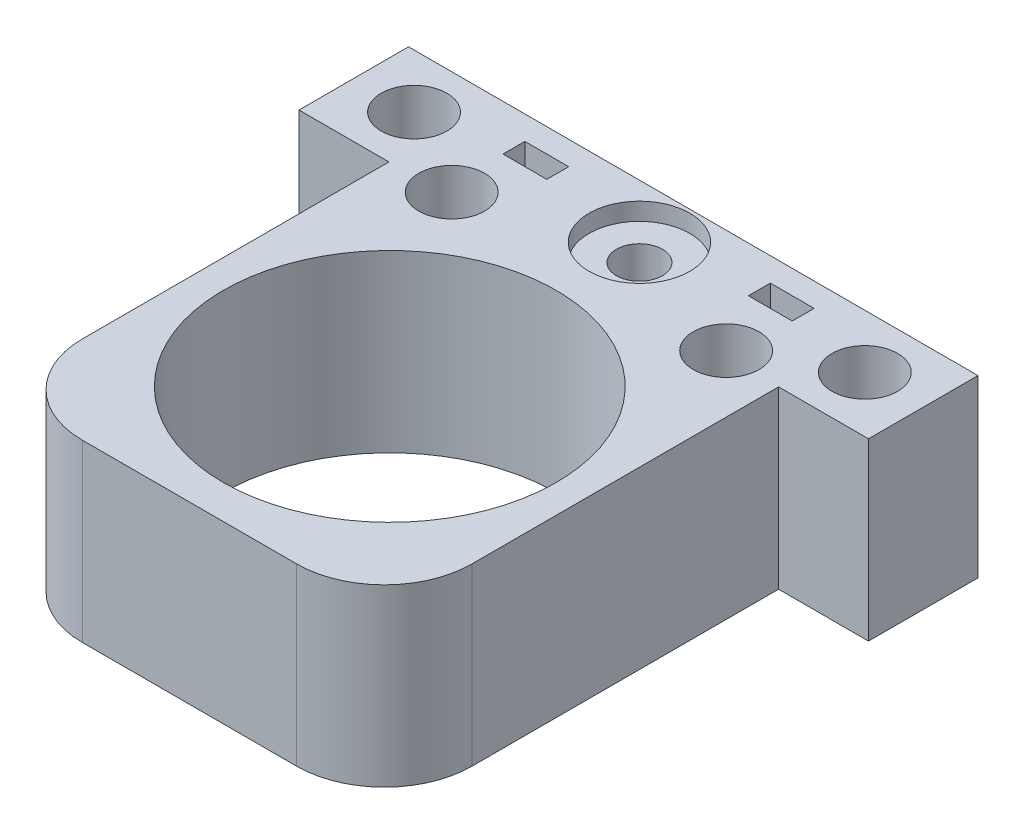
ISO-10303-21;
HEADER;
FILE_DESCRIPTION(('STEP AP214'),'2;1');
FILE_NAME('part.step','',(''),(''),'','','');
FILE_SCHEMA(('AUTOMOTIVE_DESIGN { 1 0 10303 214 1 1 1 1 }'));
ENDSEC;
DATA;
#1=APPLICATION_CONTEXT('core data for automotive mechanical design processes');
#2=APPLICATION_PROTOCOL_DEFINITION('international standard','automotive_design',2000,#1);
#3=PRODUCT_CONTEXT('',#1,'mechanical');
#4=PRODUCT('Part','Part','',(#3));
#5=PRODUCT_RELATED_PRODUCT_CATEGORY('part','',(#4));
#6=PRODUCT_DEFINITION_FORMATION('','',#4);
#7=PRODUCT_DEFINITION_CONTEXT('part definition',#1,'design');
#8=PRODUCT_DEFINITION('design','',#6,#7);
#9=PRODUCT_DEFINITION_SHAPE('','',#8);
#10=(LENGTH_UNIT() NAMED_UNIT(*) SI_UNIT(.MILLI.,.METRE.));
#11=(NAMED_UNIT(*) PLANE_ANGLE_UNIT() SI_UNIT($,.RADIAN.));
#12=(NAMED_UNIT(*) SI_UNIT($,.STERADIAN.) SOLID_ANGLE_UNIT());
#13=UNCERTAINTY_MEASURE_WITH_UNIT(LENGTH_MEASURE(1.E-05),#10,'distance_accuracy_value','');
#14=(GEOMETRIC_REPRESENTATION_CONTEXT(3) GLOBAL_UNCERTAINTY_ASSIGNED_CONTEXT((#13)) GLOBAL_UNIT_ASSIGNED_CONTEXT((#10,
#11,#12)) REPRESENTATION_CONTEXT('',''));
#15=CARTESIAN_POINT('',(0.,0.,0.));
#16=DIRECTION('',(0.,0.,1.));
#17=DIRECTION('',(1.,0.,0.));
#18=AXIS2_PLACEMENT_3D('',#15,#16,#17);
#19=CARTESIAN_POINT('',(0.,0.,-12.7142223868873));
#20=DIRECTION('',(0.,1.,0.));
#21=DIRECTION('',(0.,0.,1.));
#22=AXIS2_PLACEMENT_3D('',#19,#20,#21);
#23=CYLINDRICAL_SURFACE('',#22,5.25);
#24=CARTESIAN_POINT('',(0.,56.,-12.7142223868873));
#25=DIRECTION('',(0.,1.,0.));
#26=DIRECTION('',(0.,0.,1.));
#27=AXIS2_PLACEMENT_3D('',#24,#25,#26);
#28=CIRCLE('',#27,5.25);
#29=CARTESIAN_POINT('',(0.,56.,-7.46422238688734));
#30=VERTEX_POINT('',#29);
#31=EDGE_CURVE('E285',#30,#30,#28,.F.);
#32=ORIENTED_EDGE('',*,*,#31,.F.);
#33=EDGE_LOOP('',(#32));
#34=FACE_BOUND('',#33,.T.);
#35=CARTESIAN_POINT('',(0.,20.,-12.7142223868873));
#36=DIRECTION('',(0.,-1.,0.));
#37=DIRECTION('',(0.,0.,-1.));
#38=AXIS2_PLACEMENT_3D('',#35,#36,#37);
#39=CIRCLE('',#38,5.25);
#40=CARTESIAN_POINT('',(0.,20.,-17.9642223868873));
#41=VERTEX_POINT('',#40);
#42=EDGE_CURVE('E233',#41,#41,#39,.F.);
#43=ORIENTED_EDGE('',*,*,#42,.F.);
#44=EDGE_LOOP('',(#43));
#45=FACE_BOUND('',#44,.T.);
#46=ADVANCED_FACE('F37',(#34,#45),#23,.F.);
#47=CARTESIAN_POINT('',(65.,60.,-25.));
#48=DIRECTION('',(-1.,0.,0.));
#49=DIRECTION('',(0.,0.,1.));
#50=AXIS2_PLACEMENT_3D('',#47,#48,#49);
#51=PLANE('',#50);
#52=DIRECTION('',(0.,0.,-1.));
#53=VECTOR('',#52,1.);
#54=CARTESIAN_POINT('',(65.,60.,-25.));
#55=LINE('',#54,#53);
#56=CARTESIAN_POINT('',(65.,60.,0.));
#57=VERTEX_POINT('',#56);
#58=CARTESIAN_POINT('',(65.,60.,-25.));
#59=VERTEX_POINT('',#58);
#60=EDGE_CURVE('E291',#57,#59,#55,.T.);
#61=ORIENTED_EDGE('',*,*,#60,.F.);
#62=DIRECTION('',(0.,1.,0.));
#63=VECTOR('',#62,1.);
#64=CARTESIAN_POINT('',(65.,15.,0.));
#65=LINE('',#64,#63);
#66=CARTESIAN_POINT('',(65.,20.,0.));
#67=VERTEX_POINT('',#66);
#68=EDGE_CURVE('E199',#67,#57,#65,.T.);
#69=ORIENTED_EDGE('',*,*,#68,.F.);
#70=DIRECTION('',(0.,0.,1.));
#71=VECTOR('',#70,1.);
#72=CARTESIAN_POINT('',(65.,20.,90.));
#73=LINE('',#72,#71);
#74=CARTESIAN_POINT('',(65.,20.,-25.));
#75=VERTEX_POINT('',#74);
#76=EDGE_CURVE('E205',#75,#67,#73,.T.);
#77=ORIENTED_EDGE('',*,*,#76,.F.);
#78=DIRECTION('',(0.,-1.,0.));
#79=VECTOR('',#78,1.);
#80=CARTESIAN_POINT('',(65.,60.,-25.));
#81=LINE('',#80,#79);
#82=EDGE_CURVE('E302',#59,#75,#81,.T.);
#83=ORIENTED_EDGE('',*,*,#82,.F.);
#84=EDGE_LOOP('',(#61,#69,#77,#83));
#85=FACE_BOUND('',#84,.T.);
#86=ADVANCED_FACE('F348',(#85),#51,.F.);
#87=CARTESIAN_POINT('',(-65.,60.,-25.));
#88=DIRECTION('',(0.,0.,1.));
#89=DIRECTION('',(1.,0.,0.));
#90=AXIS2_PLACEMENT_3D('',#87,#88,#89);
#91=PLANE('',#90);
#92=DIRECTION('',(1.,0.,0.));
#93=VECTOR('',#92,1.);
#94=CARTESIAN_POINT('',(-65.,20.,-25.));
#95=LINE('',#94,#93);
#96=CARTESIAN_POINT('',(-65.,20.,-25.));
#97=VERTEX_POINT('',#96);
#98=EDGE_CURVE('E203',#97,#75,#95,.T.);
#99=ORIENTED_EDGE('',*,*,#98,.F.);
#100=DIRECTION('',(0.,-1.,0.));
#101=VECTOR('',#100,1.);
#102=CARTESIAN_POINT('',(-65.,60.,-25.));
#103=LINE('',#102,#101);
#104=CARTESIAN_POINT('',(-65.,60.,-25.));
#105=VERTEX_POINT('',#104);
#106=EDGE_CURVE('E299',#105,#97,#103,.T.);
#107=ORIENTED_EDGE('',*,*,#106,.F.);
#108=DIRECTION('',(-1.,0.,0.));
#109=VECTOR('',#108,1.);
#110=CARTESIAN_POINT('',(-65.,60.,-25.));
#111=LINE('',#110,#109);
#112=EDGE_CURVE('E296',#59,#105,#111,.T.);
#113=ORIENTED_EDGE('',*,*,#112,.F.);
#114=ORIENTED_EDGE('',*,*,#82,.T.);
#115=EDGE_LOOP('',(#99,#107,#113,#114));
#116=FACE_BOUND('',#115,.T.);
#117=ADVANCED_FACE('F354',(#116),#91,.F.);
#118=CARTESIAN_POINT('',(-65.,60.,-25.));
#119=DIRECTION('',(1.,0.,0.));
#120=DIRECTION('',(0.,0.,-1.));
#121=AXIS2_PLACEMENT_3D('',#118,#119,#120);
#122=PLANE('',#121);
#123=DIRECTION('',(0.,0.,-1.));
#124=VECTOR('',#123,1.);
#125=CARTESIAN_POINT('',(-65.,20.,90.));
#126=LINE('',#125,#124);
#127=CARTESIAN_POINT('',(-65.,20.,0.));
#128=VERTEX_POINT('',#127);
#129=EDGE_CURVE('E191',#128,#97,#126,.T.);
#130=ORIENTED_EDGE('',*,*,#129,.F.);
#131=DIRECTION('',(0.,1.,0.));
#132=VECTOR('',#131,1.);
#133=CARTESIAN_POINT('',(-65.,15.,0.));
#134=LINE('',#133,#132);
#135=CARTESIAN_POINT('',(-65.,60.,0.));
#136=VERTEX_POINT('',#135);
#137=EDGE_CURVE('E180',#128,#136,#134,.T.);
#138=ORIENTED_EDGE('',*,*,#137,.T.);
#139=DIRECTION('',(0.,0.,1.));
#140=VECTOR('',#139,1.);
#141=CARTESIAN_POINT('',(-65.,60.,-25.));
#142=LINE('',#141,#140);
#143=EDGE_CURVE('E187',#105,#136,#142,.T.);
#144=ORIENTED_EDGE('',*,*,#143,.F.);
#145=ORIENTED_EDGE('',*,*,#106,.T.);
#146=EDGE_LOOP('',(#130,#138,#144,#145));
#147=FACE_BOUND('',#146,.T.);
#148=ADVANCED_FACE('F357',(#147),#122,.F.);
#149=CARTESIAN_POINT('',(51.4526055476511,0.,-12.7142223868873));
#150=DIRECTION('',(0.,1.,0.));
#151=DIRECTION('',(0.,0.,1.));
#152=AXIS2_PLACEMENT_3D('',#149,#150,#151);
#153=CYLINDRICAL_SURFACE('',#152,7.5);
#154=CARTESIAN_POINT('',(51.4526055476511,60.,-12.7142223868873));
#155=DIRECTION('',(0.,1.,0.));
#156=DIRECTION('',(0.,0.,-1.));
#157=AXIS2_PLACEMENT_3D('',#154,#155,#156);
#158=CIRCLE('',#157,7.5);
#159=CARTESIAN_POINT('',(51.4526055476511,60.,-20.2142223868873));
#160=VERTEX_POINT('',#159);
#161=EDGE_CURVE('E292',#160,#160,#158,.T.);
#162=ORIENTED_EDGE('',*,*,#161,.T.);
#163=EDGE_LOOP('',(#162));
#164=FACE_BOUND('',#163,.T.);
#165=CARTESIAN_POINT('',(51.4526055476511,20.,-12.7142223868873));
#166=DIRECTION('',(0.,-1.,0.));
#167=DIRECTION('',(0.,0.,-1.));
#168=AXIS2_PLACEMENT_3D('',#165,#166,#167);
#169=CIRCLE('',#168,7.5);
#170=CARTESIAN_POINT('',(51.4526055476511,20.,-20.2142223868873));
#171=VERTEX_POINT('',#170);
#172=EDGE_CURVE('E230',#171,#171,#169,.F.);
#173=ORIENTED_EDGE('',*,*,#172,.F.);
#174=EDGE_LOOP('',(#173));
#175=FACE_BOUND('',#174,.T.);
#176=ADVANCED_FACE('F387',(#164,#175),#153,.F.);
#177=CARTESIAN_POINT('',(-51.4526055476511,0.,-12.7142223868873));
#178=DIRECTION('',(0.,1.,0.));
#179=DIRECTION('',(0.,0.,1.));
#180=AXIS2_PLACEMENT_3D('',#177,#178,#179);
#181=CYLINDRICAL_SURFACE('',#180,7.5);
#182=CARTESIAN_POINT('',(-51.4526055476511,60.,-12.7142223868873));
#183=DIRECTION('',(0.,1.,0.));
#184=DIRECTION('',(0.,0.,1.));
#185=AXIS2_PLACEMENT_3D('',#182,#183,#184);
#186=CIRCLE('',#185,7.5);
#187=CARTESIAN_POINT('',(-51.4526055476511,60.,-5.21422238688734));
#188=VERTEX_POINT('',#187);
#189=EDGE_CURVE('E288',#188,#188,#186,.T.);
#190=ORIENTED_EDGE('',*,*,#189,.T.);
#191=EDGE_LOOP('',(#190));
#192=FACE_BOUND('',#191,.T.);
#193=CARTESIAN_POINT('',(-51.4526055476511,20.,-12.7142223868873));
#194=DIRECTION('',(0.,-1.,0.));
#195=DIRECTION('',(0.,0.,-1.));
#196=AXIS2_PLACEMENT_3D('',#193,#194,#195);
#197=CIRCLE('',#196,7.5);
#198=CARTESIAN_POINT('',(-51.4526055476511,20.,-20.2142223868873));
#199=VERTEX_POINT('',#198);
#200=EDGE_CURVE('E227',#199,#199,#197,.F.);
#201=ORIENTED_EDGE('',*,*,#200,.F.);
#202=EDGE_LOOP('',(#201));
#203=FACE_BOUND('',#202,.T.);
#204=ADVANCED_FACE('F383',(#192,#203),#181,.F.);
#205=CARTESIAN_POINT('',(-33.01308524261,0.,-19.5794065637342));
#206=DIRECTION('',(-1.,0.,0.));
#207=DIRECTION('',(0.,0.,1.));
#208=AXIS2_PLACEMENT_3D('',#205,#206,#207);
#209=PLANE('',#208);
#210=DIRECTION('',(0.,0.,1.));
#211=VECTOR('',#210,1.);
#212=CARTESIAN_POINT('',(-33.01308524261,20.,-19.5794065637342));
#213=LINE('',#212,#211);
#214=CARTESIAN_POINT('',(-33.01308524261,20.,-19.5794065637342));
#215=VERTEX_POINT('',#214);
#216=CARTESIAN_POINT('',(-33.01308524261,20.,-14.5794065637342));
#217=VERTEX_POINT('',#216);
#218=EDGE_CURVE('E225',#215,#217,#213,.T.);
#219=ORIENTED_EDGE('',*,*,#218,.F.);
#220=DIRECTION('',(0.,1.,0.));
#221=VECTOR('',#220,1.);
#222=CARTESIAN_POINT('',(-33.01308524261,0.,-19.5794065637342));
#223=LINE('',#222,#221);
#224=CARTESIAN_POINT('',(-33.01308524261,60.,-19.5794065637342));
#225=VERTEX_POINT('',#224);
#226=EDGE_CURVE('E274',#215,#225,#223,.T.);
#227=ORIENTED_EDGE('',*,*,#226,.T.);
#228=DIRECTION('',(0.,0.,1.));
#229=VECTOR('',#228,1.);
#230=CARTESIAN_POINT('',(-33.01308524261,60.,-19.5794065637342));
#231=LINE('',#230,#229);
#232=CARTESIAN_POINT('',(-33.01308524261,60.,-14.5794065637342));
#233=VERTEX_POINT('',#232);
#234=EDGE_CURVE('E256',#225,#233,#231,.T.);
#235=ORIENTED_EDGE('',*,*,#234,.T.);
#236=DIRECTION('',(0.,1.,0.));
#237=VECTOR('',#236,1.);
#238=CARTESIAN_POINT('',(-33.01308524261,0.,-14.5794065637342));
#239=LINE('',#238,#237);
#240=EDGE_CURVE('E273',#217,#233,#239,.T.);
#241=ORIENTED_EDGE('',*,*,#240,.F.);
#242=EDGE_LOOP('',(#219,#227,#235,#241));
#243=FACE_BOUND('',#242,.T.);
#244=ADVANCED_FACE('F386',(#243),#209,.F.);
#245=CARTESIAN_POINT('',(-33.01308524261,0.,-19.5794065637342));
#246=DIRECTION('',(0.,0.,-1.));
#247=DIRECTION('',(-1.,0.,0.));
#248=AXIS2_PLACEMENT_3D('',#245,#246,#247);
#249=PLANE('',#248);
#250=DIRECTION('',(-1.,0.,0.));
#251=VECTOR('',#250,1.);
#252=CARTESIAN_POINT('',(-33.01308524261,20.,-19.5794065637342));
#253=LINE('',#252,#251);
#254=CARTESIAN_POINT('',(-23.01308524261,20.,-19.5794065637342));
#255=VERTEX_POINT('',#254);
#256=EDGE_CURVE('E223',#255,#215,#253,.T.);
#257=ORIENTED_EDGE('',*,*,#256,.F.);
#258=DIRECTION('',(0.,1.,0.));
#259=VECTOR('',#258,1.);
#260=CARTESIAN_POINT('',(-23.01308524261,0.,-19.5794065637342));
#261=LINE('',#260,#259);
#262=CARTESIAN_POINT('',(-23.01308524261,60.,-19.5794065637342));
#263=VERTEX_POINT('',#262);
#264=EDGE_CURVE('E277',#255,#263,#261,.T.);
#265=ORIENTED_EDGE('',*,*,#264,.T.);
#266=DIRECTION('',(-1.,0.,0.));
#267=VECTOR('',#266,1.);
#268=CARTESIAN_POINT('',(-33.01308524261,60.,-19.5794065637342));
#269=LINE('',#268,#267);
#270=EDGE_CURVE('E270',#263,#225,#269,.T.);
#271=ORIENTED_EDGE('',*,*,#270,.T.);
#272=ORIENTED_EDGE('',*,*,#226,.F.);
#273=EDGE_LOOP('',(#257,#265,#271,#272));
#274=FACE_BOUND('',#273,.T.);
#275=ADVANCED_FACE('F421',(#274),#249,.F.);
#276=CARTESIAN_POINT('',(-23.01308524261,0.,-19.5794065637342));
#277=DIRECTION('',(1.,0.,0.));
#278=DIRECTION('',(0.,0.,-1.));
#279=AXIS2_PLACEMENT_3D('',#276,#277,#278);
#280=PLANE('',#279);
#281=DIRECTION('',(0.,0.,-1.));
#282=VECTOR('',#281,1.);
#283=CARTESIAN_POINT('',(-23.01308524261,20.,-19.5794065637342));
#284=LINE('',#283,#282);
#285=CARTESIAN_POINT('',(-23.01308524261,20.,-14.5794065637342));
#286=VERTEX_POINT('',#285);
#287=EDGE_CURVE('E221',#286,#255,#284,.T.);
#288=ORIENTED_EDGE('',*,*,#287,.F.);
#289=DIRECTION('',(0.,1.,0.));
#290=VECTOR('',#289,1.);
#291=CARTESIAN_POINT('',(-23.01308524261,0.,-14.5794065637342));
#292=LINE('',#291,#290);
#293=CARTESIAN_POINT('',(-23.01308524261,60.,-14.5794065637342));
#294=VERTEX_POINT('',#293);
#295=EDGE_CURVE('E279',#286,#294,#292,.T.);
#296=ORIENTED_EDGE('',*,*,#295,.T.);
#297=DIRECTION('',(0.,0.,-1.));
#298=VECTOR('',#297,1.);
#299=CARTESIAN_POINT('',(-23.01308524261,60.,-19.5794065637342));
#300=LINE('',#299,#298);
#301=EDGE_CURVE('E267',#294,#263,#300,.T.);
#302=ORIENTED_EDGE('',*,*,#301,.T.);
#303=ORIENTED_EDGE('',*,*,#264,.F.);
#304=EDGE_LOOP('',(#288,#296,#302,#303));
#305=FACE_BOUND('',#304,.T.);
#306=ADVANCED_FACE('F430',(#305),#280,.F.);
#307=CARTESIAN_POINT('',(-33.01308524261,0.,-14.5794065637342));
#308=DIRECTION('',(0.,0.,1.));
#309=DIRECTION('',(1.,0.,0.));
#310=AXIS2_PLACEMENT_3D('',#307,#308,#309);
#311=PLANE('',#310);
#312=DIRECTION('',(1.,0.,0.));
#313=VECTOR('',#312,1.);
#314=CARTESIAN_POINT('',(-33.01308524261,20.,-14.5794065637342));
#315=LINE('',#314,#313);
#316=EDGE_CURVE('E219',#217,#286,#315,.T.);
#317=ORIENTED_EDGE('',*,*,#316,.F.);
#318=ORIENTED_EDGE('',*,*,#240,.T.);
#319=DIRECTION('',(1.,0.,0.));
#320=VECTOR('',#319,1.);
#321=CARTESIAN_POINT('',(-33.01308524261,60.,-14.5794065637342));
#322=LINE('',#321,#320);
#323=EDGE_CURVE('E264',#233,#294,#322,.T.);
#324=ORIENTED_EDGE('',*,*,#323,.T.);
#325=ORIENTED_EDGE('',*,*,#295,.F.);
#326=EDGE_LOOP('',(#317,#318,#324,#325));
#327=FACE_BOUND('',#326,.T.);
#328=ADVANCED_FACE('F439',(#327),#311,.F.);
#329=CARTESIAN_POINT('',(33.01308524261,0.,-19.5794065637342));
#330=DIRECTION('',(0.,0.,-1.));
#331=DIRECTION('',(-1.,0.,0.));
#332=AXIS2_PLACEMENT_3D('',#329,#330,#331);
#333=PLANE('',#332);
#334=DIRECTION('',(-1.,0.,0.));
#335=VECTOR('',#334,1.);
#336=CARTESIAN_POINT('',(33.01308524261,20.,-19.5794065637342));
#337=LINE('',#336,#335);
#338=CARTESIAN_POINT('',(33.01308524261,20.,-19.5794065637342));
#339=VERTEX_POINT('',#338);
#340=CARTESIAN_POINT('',(23.01308524261,20.,-19.5794065637342));
#341=VERTEX_POINT('',#340);
#342=EDGE_CURVE('E217',#339,#341,#337,.T.);
#343=ORIENTED_EDGE('',*,*,#342,.F.);
#344=DIRECTION('',(0.,1.,0.));
#345=VECTOR('',#344,1.);
#346=CARTESIAN_POINT('',(33.01308524261,0.,-19.5794065637342));
#347=LINE('',#346,#345);
#348=CARTESIAN_POINT('',(33.01308524261,60.,-19.5794065637342));
#349=VERTEX_POINT('',#348);
#350=EDGE_CURVE('E254',#339,#349,#347,.T.);
#351=ORIENTED_EDGE('',*,*,#350,.T.);
#352=DIRECTION('',(-1.,0.,0.));
#353=VECTOR('',#352,1.);
#354=CARTESIAN_POINT('',(33.01308524261,60.,-19.5794065637342));
#355=LINE('',#354,#353);
#356=CARTESIAN_POINT('',(23.01308524261,60.,-19.5794065637342));
#357=VERTEX_POINT('',#356);
#358=EDGE_CURVE('E241',#349,#357,#355,.T.);
#359=ORIENTED_EDGE('',*,*,#358,.T.);
#360=DIRECTION('',(0.,1.,0.));
#361=VECTOR('',#360,1.);
#362=CARTESIAN_POINT('',(23.01308524261,0.,-19.5794065637342));
#363=LINE('',#362,#361);
#364=EDGE_CURVE('E253',#341,#357,#363,.T.);
#365=ORIENTED_EDGE('',*,*,#364,.F.);
#366=EDGE_LOOP('',(#343,#351,#359,#365));
#367=FACE_BOUND('',#366,.T.);
#368=ADVANCED_FACE('F448',(#367),#333,.F.);
#369=CARTESIAN_POINT('',(33.01308524261,0.,-19.5794065637342));
#370=DIRECTION('',(1.,0.,0.));
#371=DIRECTION('',(0.,0.,-1.));
#372=AXIS2_PLACEMENT_3D('',#369,#370,#371);
#373=PLANE('',#372);
#374=DIRECTION('',(0.,0.,-1.));
#375=VECTOR('',#374,1.);
#376=CARTESIAN_POINT('',(33.01308524261,20.,-19.5794065637342));
#377=LINE('',#376,#375);
#378=CARTESIAN_POINT('',(33.01308524261,20.,-14.5794065637342));
#379=VERTEX_POINT('',#378);
#380=EDGE_CURVE('E215',#379,#339,#377,.T.);
#381=ORIENTED_EDGE('',*,*,#380,.F.);
#382=DIRECTION('',(0.,1.,0.));
#383=VECTOR('',#382,1.);
#384=CARTESIAN_POINT('',(33.01308524261,0.,-14.5794065637342));
#385=LINE('',#384,#383);
#386=CARTESIAN_POINT('',(33.01308524261,60.,-14.5794065637342));
#387=VERTEX_POINT('',#386);
#388=EDGE_CURVE('E257',#379,#387,#385,.T.);
#389=ORIENTED_EDGE('',*,*,#388,.T.);
#390=DIRECTION('',(0.,0.,-1.));
#391=VECTOR('',#390,1.);
#392=CARTESIAN_POINT('',(33.01308524261,60.,-19.5794065637342));
#393=LINE('',#392,#391);
#394=EDGE_CURVE('E250',#387,#349,#393,.T.);
#395=ORIENTED_EDGE('',*,*,#394,.T.);
#396=ORIENTED_EDGE('',*,*,#350,.F.);
#397=EDGE_LOOP('',(#381,#389,#395,#396));
#398=FACE_BOUND('',#397,.T.);
#399=ADVANCED_FACE('F457',(#398),#373,.F.);
#400=CARTESIAN_POINT('',(33.01308524261,0.,-14.5794065637342));
#401=DIRECTION('',(0.,0.,1.));
#402=DIRECTION('',(1.,0.,0.));
#403=AXIS2_PLACEMENT_3D('',#400,#401,#402);
#404=PLANE('',#403);
#405=DIRECTION('',(1.,0.,0.));
#406=VECTOR('',#405,1.);
#407=CARTESIAN_POINT('',(33.01308524261,20.,-14.5794065637342));
#408=LINE('',#407,#406);
#409=CARTESIAN_POINT('',(23.01308524261,20.,-14.5794065637342));
#410=VERTEX_POINT('',#409);
#411=EDGE_CURVE('E213',#410,#379,#408,.T.);
#412=ORIENTED_EDGE('',*,*,#411,.F.);
#413=DIRECTION('',(0.,1.,0.));
#414=VECTOR('',#413,1.);
#415=CARTESIAN_POINT('',(23.01308524261,0.,-14.5794065637342));
#416=LINE('',#415,#414);
#417=CARTESIAN_POINT('',(23.01308524261,60.,-14.5794065637342));
#418=VERTEX_POINT('',#417);
#419=EDGE_CURVE('E259',#410,#418,#416,.T.);
#420=ORIENTED_EDGE('',*,*,#419,.T.);
#421=DIRECTION('',(1.,0.,0.));
#422=VECTOR('',#421,1.);
#423=CARTESIAN_POINT('',(33.01308524261,60.,-14.5794065637342));
#424=LINE('',#423,#422);
#425=EDGE_CURVE('E247',#418,#387,#424,.T.);
#426=ORIENTED_EDGE('',*,*,#425,.T.);
#427=ORIENTED_EDGE('',*,*,#388,.F.);
#428=EDGE_LOOP('',(#412,#420,#426,#427));
#429=FACE_BOUND('',#428,.T.);
#430=ADVANCED_FACE('F466',(#429),#404,.F.);
#431=CARTESIAN_POINT('',(23.01308524261,0.,-19.5794065637342));
#432=DIRECTION('',(-1.,0.,0.));
#433=DIRECTION('',(0.,0.,1.));
#434=AXIS2_PLACEMENT_3D('',#431,#432,#433);
#435=PLANE('',#434);
#436=DIRECTION('',(0.,0.,1.));
#437=VECTOR('',#436,1.);
#438=CARTESIAN_POINT('',(23.01308524261,20.,-19.5794065637342));
#439=LINE('',#438,#437);
#440=EDGE_CURVE('E211',#341,#410,#439,.T.);
#441=ORIENTED_EDGE('',*,*,#440,.F.);
#442=ORIENTED_EDGE('',*,*,#364,.T.);
#443=DIRECTION('',(0.,0.,1.));
#444=VECTOR('',#443,1.);
#445=CARTESIAN_POINT('',(23.01308524261,60.,-19.5794065637342));
#446=LINE('',#445,#444);
#447=EDGE_CURVE('E244',#357,#418,#446,.T.);
#448=ORIENTED_EDGE('',*,*,#447,.T.);
#449=ORIENTED_EDGE('',*,*,#419,.F.);
#450=EDGE_LOOP('',(#441,#442,#448,#449));
#451=FACE_BOUND('',#450,.T.);
#452=ADVANCED_FACE('F475',(#451),#435,.F.);
#453=CARTESIAN_POINT('',(-65.,0.,90.));
#454=DIRECTION('',(0.,0.,1.));
#455=DIRECTION('',(1.,0.,0.));
#456=AXIS2_PLACEMENT_3D('',#453,#454,#455);
#457=PLANE('',#456);
#458=DIRECTION('',(-1.,0.,0.));
#459=VECTOR('',#458,1.);
#460=CARTESIAN_POINT('',(-65.,20.,90.));
#461=LINE('',#460,#459);
#462=CARTESIAN_POINT('',(24.4743587222466,20.,90.));
#463=VERTEX_POINT('',#462);
#464=CARTESIAN_POINT('',(-24.4743587222466,20.,90.));
#465=VERTEX_POINT('',#464);
#466=EDGE_CURVE('E208',#463,#465,#461,.T.);
#467=ORIENTED_EDGE('',*,*,#466,.F.);
#468=DIRECTION('',(0.,1.,0.));
#469=VECTOR('',#468,1.);
#470=CARTESIAN_POINT('',(24.4743587222466,60.,90.));
#471=LINE('',#470,#469);
#472=CARTESIAN_POINT('',(24.4743587222466,60.,90.));
#473=VERTEX_POINT('',#472);
#474=EDGE_CURVE('E318',#463,#473,#471,.T.);
#475=ORIENTED_EDGE('',*,*,#474,.T.);
#476=DIRECTION('',(1.,0.,0.));
#477=VECTOR('',#476,1.);
#478=CARTESIAN_POINT('',(-65.,60.,90.));
#479=LINE('',#478,#477);
#480=CARTESIAN_POINT('',(-24.4743587222466,60.,90.));
#481=VERTEX_POINT('',#480);
#482=EDGE_CURVE('E239',#481,#473,#479,.T.);
#483=ORIENTED_EDGE('',*,*,#482,.F.);
#484=DIRECTION('',(0.,1.,0.));
#485=VECTOR('',#484,1.);
#486=CARTESIAN_POINT('',(-24.4743587222466,20.,90.));
#487=LINE('',#486,#485);
#488=EDGE_CURVE('E316',#481,#465,#487,.F.);
#489=ORIENTED_EDGE('',*,*,#488,.T.);
#490=EDGE_LOOP('',(#467,#475,#483,#489));
#491=FACE_BOUND('',#490,.T.);
#492=ADVANCED_FACE('F334',(#491),#457,.T.);
#493=CARTESIAN_POINT('',(0.,0.,44.2857776131127));
#494=DIRECTION('',(0.,1.,0.));
#495=DIRECTION('',(0.,0.,1.));
#496=AXIS2_PLACEMENT_3D('',#493,#494,#495);
#497=CYLINDRICAL_SURFACE('',#496,38.);
#498=CARTESIAN_POINT('',(0.,60.,44.2857776131127));
#499=DIRECTION('',(0.,1.,0.));
#500=DIRECTION('',(0.,0.,1.));
#501=AXIS2_PLACEMENT_3D('',#498,#499,#500);
#502=CIRCLE('',#501,38.);
#503=CARTESIAN_POINT('',(0.,60.,82.2857776131127));
#504=VERTEX_POINT('',#503);
#505=EDGE_CURVE('E236',#504,#504,#502,.T.);
#506=CARTESIAN_POINT('',(0.,20.,44.2857776131127));
#507=DIRECTION('',(0.,-1.,0.));
#508=DIRECTION('',(0.,0.,-1.));
#509=AXIS2_PLACEMENT_3D('',#506,#507,#508);
#510=CIRCLE('',#509,38.);
#511=CARTESIAN_POINT('',(0.,20.,82.2857776131127));
#512=VERTEX_POINT('',#511);
#513=EDGE_CURVE('E210',#512,#512,#510,.F.);
#514=CARTESIAN_POINT('',(0.,60.,82.2857776131127));
#515=CARTESIAN_POINT('',(0.,59.5833333333333,82.2857776131127));
#516=CARTESIAN_POINT('',(0.,59.1666666666667,82.2857776131127));
#517=CARTESIAN_POINT('',(0.,58.3333333333333,82.2857776131127));
#518=CARTESIAN_POINT('',(0.,57.9166666666667,82.2857776131127));
#519=CARTESIAN_POINT('',(0.,57.0833333333333,82.2857776131127));
#520=CARTESIAN_POINT('',(0.,56.6666666666667,82.2857776131127));
#521=CARTESIAN_POINT('',(0.,55.8333333333333,82.2857776131127));
#522=CARTESIAN_POINT('',(0.,55.4166666666667,82.2857776131127));
#523=CARTESIAN_POINT('',(0.,54.5833333333333,82.2857776131127));
#524=CARTESIAN_POINT('',(0.,54.1666666666667,82.2857776131127));
#525=CARTESIAN_POINT('',(0.,53.3333333333333,82.2857776131127));
#526=CARTESIAN_POINT('',(0.,52.9166666666667,82.2857776131127));
#527=CARTESIAN_POINT('',(0.,52.0833333333333,82.2857776131127));
#528=CARTESIAN_POINT('',(0.,51.6666666666667,82.2857776131127));
#529=CARTESIAN_POINT('',(0.,50.8333333333333,82.2857776131127));
#530=CARTESIAN_POINT('',(0.,50.4166666666667,82.2857776131127));
#531=CARTESIAN_POINT('',(0.,49.5833333333333,82.2857776131127));
#532=CARTESIAN_POINT('',(0.,49.1666666666667,82.2857776131127));
#533=CARTESIAN_POINT('',(0.,48.3333333333333,82.2857776131127));
#534=CARTESIAN_POINT('',(0.,47.9166666666667,82.2857776131127));
#535=CARTESIAN_POINT('',(0.,47.0833333333333,82.2857776131127));
#536=CARTESIAN_POINT('',(0.,46.6666666666667,82.2857776131127));
#537=CARTESIAN_POINT('',(0.,45.8333333333333,82.2857776131127));
#538=CARTESIAN_POINT('',(0.,45.4166666666667,82.2857776131127));
#539=CARTESIAN_POINT('',(0.,44.5833333333333,82.2857776131127));
#540=CARTESIAN_POINT('',(0.,44.1666666666667,82.2857776131127));
#541=CARTESIAN_POINT('',(0.,43.3333333333333,82.2857776131127));
#542=CARTESIAN_POINT('',(0.,42.9166666666667,82.2857776131127));
#543=CARTESIAN_POINT('',(0.,42.0833333333333,82.2857776131127));
#544=CARTESIAN_POINT('',(0.,41.6666666666667,82.2857776131127));
#545=CARTESIAN_POINT('',(0.,40.8333333333333,82.2857776131127));
#546=CARTESIAN_POINT('',(0.,40.4166666666667,82.2857776131127));
#547=CARTESIAN_POINT('',(0.,39.5833333333333,82.2857776131127));
#548=CARTESIAN_POINT('',(0.,39.1666666666667,82.2857776131127));
#549=CARTESIAN_POINT('',(0.,38.3333333333333,82.2857776131127));
#550=CARTESIAN_POINT('',(0.,37.9166666666667,82.2857776131127));
#551=CARTESIAN_POINT('',(0.,37.0833333333333,82.2857776131127));
#552=CARTESIAN_POINT('',(0.,36.6666666666667,82.2857776131127));
#553=CARTESIAN_POINT('',(0.,35.8333333333333,82.2857776131127));
#554=CARTESIAN_POINT('',(0.,35.4166666666667,82.2857776131127));
#555=CARTESIAN_POINT('',(0.,34.5833333333333,82.2857776131127));
#556=CARTESIAN_POINT('',(0.,34.1666666666667,82.2857776131127));
#557=CARTESIAN_POINT('',(0.,33.3333333333333,82.2857776131127));
#558=CARTESIAN_POINT('',(0.,32.9166666666667,82.2857776131127));
#559=CARTESIAN_POINT('',(0.,32.0833333333333,82.2857776131127));
#560=CARTESIAN_POINT('',(0.,31.6666666666667,82.2857776131127));
#561=CARTESIAN_POINT('',(0.,30.8333333333333,82.2857776131127));
#562=CARTESIAN_POINT('',(0.,30.4166666666667,82.2857776131127));
#563=CARTESIAN_POINT('',(0.,29.5833333333333,82.2857776131127));
#564=CARTESIAN_POINT('',(0.,29.1666666666667,82.2857776131127));
#565=CARTESIAN_POINT('',(0.,28.3333333333333,82.2857776131127));
#566=CARTESIAN_POINT('',(0.,27.9166666666667,82.2857776131127));
#567=CARTESIAN_POINT('',(0.,27.0833333333333,82.2857776131127));
#568=CARTESIAN_POINT('',(0.,26.6666666666667,82.2857776131127));
#569=CARTESIAN_POINT('',(0.,25.8333333333333,82.2857776131127));
#570=CARTESIAN_POINT('',(0.,25.4166666666667,82.2857776131127));
#571=CARTESIAN_POINT('',(0.,24.5833333333333,82.2857776131127));
#572=CARTESIAN_POINT('',(0.,24.1666666666667,82.2857776131127));
#573=CARTESIAN_POINT('',(0.,23.3333333333333,82.2857776131127));
#574=CARTESIAN_POINT('',(0.,22.9166666666667,82.2857776131127));
#575=CARTESIAN_POINT('',(0.,22.0833333333333,82.2857776131127));
#576=CARTESIAN_POINT('',(0.,21.6666666666667,82.2857776131127));
#577=CARTESIAN_POINT('',(0.,20.8333333333333,82.2857776131127));
#578=CARTESIAN_POINT('',(0.,20.4166666666667,82.2857776131127));
#579=CARTESIAN_POINT('',(0.,20.,82.2857776131127));
#580=B_SPLINE_CURVE_WITH_KNOTS('',3,(#514,#515,#516,#517,#518,#519,#520,#521,#522,#523,#524,
#525,#526,#527,#528,#529,#530,#531,#532,#533,#534,#535,#536,#537,#538,#539,#540,#541,#542,#543,
#544,#545,#546,#547,#548,#549,#550,#551,#552,#553,#554,#555,#556,#557,#558,#559,#560,#561,#562,
#563,#564,#565,#566,#567,#568,#569,#570,#571,#572,#573,#574,#575,#576,#577,#578,#579),
.UNSPECIFIED.,.F.,.F.,(4,2,2,2,2,2,2,2,2,2,2,2,2,2,2,2,2,2,2,2,2,2,2,2,2,2,2,2,2,2,2,2,4),(0.,
1.25,2.5,3.75,5.,6.25,7.5,8.75,10.,11.25,12.5,13.75,15.,16.25,17.5,18.75,20.,21.25,22.5,23.75,
25.,26.25,27.5,28.75,30.,31.25,32.5,33.75,35.,36.25,37.5,38.75,40.),.UNSPECIFIED.);
#581=EDGE_CURVE('BSEAM395',#504,#512,#580,.T.);
#582=ORIENTED_EDGE('',*,*,#505,.T.);
#583=ORIENTED_EDGE('',*,*,#513,.F.);
#584=ORIENTED_EDGE('',*,*,#581,.T.);
#585=ORIENTED_EDGE('',*,*,#581,.F.);
#586=EDGE_LOOP('',(#582,#584,#583,#585));
#587=FACE_BOUND('',#586,.T.);
#588=ADVANCED_FACE('F395',(#587),#497,.F.);
#589=CARTESIAN_POINT('',(0.,60.,45.));
#590=DIRECTION('',(0.,1.,0.));
#591=DIRECTION('',(0.,0.,1.));
#592=AXIS2_PLACEMENT_3D('',#589,#590,#591);
#593=PLANE('',#592);
#594=CARTESIAN_POINT('',(-31.3268293189548,60.,-1.1803993973218));
#595=DIRECTION('',(0.,1.,0.));
#596=DIRECTION('',(0.,0.,1.));
#597=AXIS2_PLACEMENT_3D('',#594,#595,#596);
#598=CIRCLE('',#597,7.5);
#599=CARTESIAN_POINT('',(-31.3268293189548,60.,6.3196006026782));
#600=VERTEX_POINT('',#599);
#601=EDGE_CURVE('E643',#600,#600,#598,.T.);
#602=ORIENTED_EDGE('',*,*,#601,.F.);
#603=EDGE_LOOP('',(#602));
#604=FACE_BOUND('',#603,.T.);
#605=CARTESIAN_POINT('',(31.3268293189548,60.,-1.18039939732181));
#606=DIRECTION('',(0.,1.,0.));
#607=DIRECTION('',(0.,0.,-1.));
#608=AXIS2_PLACEMENT_3D('',#605,#606,#607);
#609=CIRCLE('',#608,7.5);
#610=CARTESIAN_POINT('',(31.3268293189548,60.,-8.68039939732181));
#611=VERTEX_POINT('',#610);
#612=EDGE_CURVE('E648',#611,#611,#609,.T.);
#613=ORIENTED_EDGE('',*,*,#612,.F.);
#614=EDGE_LOOP('',(#613));
#615=FACE_BOUND('',#614,.T.);
#616=ORIENTED_EDGE('',*,*,#482,.T.);
#617=CARTESIAN_POINT('',(24.4743587222466,60.,70.));
#618=DIRECTION('',(0.,1.,0.));
#619=DIRECTION('',(0.,0.,1.));
#620=AXIS2_PLACEMENT_3D('',#617,#618,#619);
#621=CIRCLE('',#620,20.);
#622=CARTESIAN_POINT('',(44.4743587222466,60.,70.));
#623=VERTEX_POINT('',#622);
#624=EDGE_CURVE('E323',#473,#623,#621,.T.);
#625=ORIENTED_EDGE('',*,*,#624,.T.);
#626=DIRECTION('',(0.,0.,1.));
#627=VECTOR('',#626,1.);
#628=CARTESIAN_POINT('',(44.4743587222466,60.,0.));
#629=LINE('',#628,#627);
#630=CARTESIAN_POINT('',(44.4743587222466,60.,0.));
#631=VERTEX_POINT('',#630);
#632=EDGE_CURVE('E196',#631,#623,#629,.T.);
#633=ORIENTED_EDGE('',*,*,#632,.F.);
#634=DIRECTION('',(-1.,0.,0.));
#635=VECTOR('',#634,1.);
#636=CARTESIAN_POINT('',(65.,60.,0.));
#637=LINE('',#636,#635);
#638=EDGE_CURVE('E193',#57,#631,#637,.T.);
#639=ORIENTED_EDGE('',*,*,#638,.F.);
#640=ORIENTED_EDGE('',*,*,#60,.T.);
#641=ORIENTED_EDGE('',*,*,#112,.T.);
#642=ORIENTED_EDGE('',*,*,#143,.T.);
#643=DIRECTION('',(-1.,0.,0.));
#644=VECTOR('',#643,1.);
#645=CARTESIAN_POINT('',(-65.,60.,0.));
#646=LINE('',#645,#644);
#647=CARTESIAN_POINT('',(-44.4743587222466,60.,0.));
#648=VERTEX_POINT('',#647);
#649=EDGE_CURVE('E172',#648,#136,#646,.T.);
#650=ORIENTED_EDGE('',*,*,#649,.F.);
#651=DIRECTION('',(0.,0.,-1.));
#652=VECTOR('',#651,1.);
#653=CARTESIAN_POINT('',(-44.4743587222466,60.,0.));
#654=LINE('',#653,#652);
#655=CARTESIAN_POINT('',(-44.4743587222466,60.,70.));
#656=VERTEX_POINT('',#655);
#657=EDGE_CURVE('E164',#656,#648,#654,.T.);
#658=ORIENTED_EDGE('',*,*,#657,.F.);
#659=CARTESIAN_POINT('',(-24.4743587222466,60.,70.));
#660=DIRECTION('',(0.,1.,0.));
#661=DIRECTION('',(0.,0.,1.));
#662=AXIS2_PLACEMENT_3D('',#659,#660,#661);
#663=CIRCLE('',#662,20.);
#664=EDGE_CURVE('E321',#656,#481,#663,.T.);
#665=ORIENTED_EDGE('',*,*,#664,.T.);
#666=EDGE_LOOP('',(#616,#625,#633,#639,#640,#641,#642,#650,#658,#665));
#667=FACE_BOUND('',#666,.T.);
#668=ORIENTED_EDGE('',*,*,#505,.F.);
#669=EDGE_LOOP('',(#668));
#670=FACE_BOUND('',#669,.T.);
#671=ORIENTED_EDGE('',*,*,#358,.F.);
#672=ORIENTED_EDGE('',*,*,#394,.F.);
#673=ORIENTED_EDGE('',*,*,#425,.F.);
#674=ORIENTED_EDGE('',*,*,#447,.F.);
#675=EDGE_LOOP('',(#671,#672,#673,#674));
#676=FACE_BOUND('',#675,.T.);
#677=ORIENTED_EDGE('',*,*,#234,.F.);
#678=ORIENTED_EDGE('',*,*,#270,.F.);
#679=ORIENTED_EDGE('',*,*,#301,.F.);
#680=ORIENTED_EDGE('',*,*,#323,.F.);
#681=EDGE_LOOP('',(#677,#678,#679,#680));
#682=FACE_BOUND('',#681,.T.);
#683=CARTESIAN_POINT('',(0.,60.,-12.7142223868873));
#684=DIRECTION('',(0.,1.,0.));
#685=DIRECTION('',(0.,0.,1.));
#686=AXIS2_PLACEMENT_3D('',#683,#684,#685);
#687=CIRCLE('',#686,11.5);
#688=CARTESIAN_POINT('',(0.,60.,-1.21422238688734));
#689=VERTEX_POINT('',#688);
#690=EDGE_CURVE('E276',#689,#689,#687,.T.);
#691=ORIENTED_EDGE('',*,*,#690,.F.);
#692=EDGE_LOOP('',(#691));
#693=FACE_BOUND('',#692,.T.);
#694=ORIENTED_EDGE('',*,*,#189,.F.);
#695=EDGE_LOOP('',(#694));
#696=FACE_BOUND('',#695,.T.);
#697=ORIENTED_EDGE('',*,*,#161,.F.);
#698=EDGE_LOOP('',(#697));
#699=FACE_BOUND('',#698,.T.);
#700=ADVANCED_FACE('F184',(#604,#615,#667,#670,#676,#682,#693,#696,#699),#593,.T.);
#701=CARTESIAN_POINT('',(0.,56.,-12.7142223868873));
#702=DIRECTION('',(0.,1.,0.));
#703=DIRECTION('',(0.,0.,1.));
#704=AXIS2_PLACEMENT_3D('',#701,#702,#703);
#705=PLANE('',#704);
#706=CARTESIAN_POINT('',(0.,56.,-12.7142223868873));
#707=DIRECTION('',(0.,1.,0.));
#708=DIRECTION('',(0.,0.,1.));
#709=AXIS2_PLACEMENT_3D('',#706,#707,#708);
#710=CIRCLE('',#709,11.5);
#711=CARTESIAN_POINT('',(0.,56.,-1.21422238688734));
#712=VERTEX_POINT('',#711);
#713=EDGE_CURVE('E282',#712,#712,#710,.T.);
#714=ORIENTED_EDGE('',*,*,#713,.T.);
#715=EDGE_LOOP('',(#714));
#716=FACE_BOUND('',#715,.T.);
#717=ORIENTED_EDGE('',*,*,#31,.T.);
#718=EDGE_LOOP('',(#717));
#719=FACE_BOUND('',#718,.T.);
#720=ADVANCED_FACE('F394',(#716,#719),#705,.T.);
#721=CARTESIAN_POINT('',(0.,56.,-12.7142223868873));
#722=DIRECTION('',(0.,1.,0.));
#723=DIRECTION('',(0.,0.,1.));
#724=AXIS2_PLACEMENT_3D('',#721,#722,#723);
#725=CYLINDRICAL_SURFACE('',#724,11.5);
#726=ORIENTED_EDGE('',*,*,#713,.F.);
#727=EDGE_LOOP('',(#726));
#728=FACE_BOUND('',#727,.T.);
#729=ORIENTED_EDGE('',*,*,#690,.T.);
#730=EDGE_LOOP('',(#729));
#731=FACE_BOUND('',#730,.T.);
#732=ADVANCED_FACE('F381',(#728,#731),#725,.F.);
#733=CARTESIAN_POINT('',(0.,20.,0.));
#734=DIRECTION('',(0.,-1.,0.));
#735=DIRECTION('',(0.,0.,-1.));
#736=AXIS2_PLACEMENT_3D('',#733,#734,#735);
#737=PLANE('',#736);
#738=CARTESIAN_POINT('',(-31.3268293189548,20.,-1.1803993973218));
#739=DIRECTION('',(0.,1.,0.));
#740=DIRECTION('',(0.,0.,1.));
#741=AXIS2_PLACEMENT_3D('',#738,#739,#740);
#742=CIRCLE('',#741,7.5);
#743=CARTESIAN_POINT('',(-31.3268293189548,20.,6.3196006026782));
#744=VERTEX_POINT('',#743);
#745=EDGE_CURVE('E197',#744,#744,#742,.T.);
#746=ORIENTED_EDGE('',*,*,#745,.T.);
#747=EDGE_LOOP('',(#746));
#748=FACE_BOUND('',#747,.T.);
#749=CARTESIAN_POINT('',(31.3268293189548,20.,-1.18039939732181));
#750=DIRECTION('',(0.,1.,0.));
#751=DIRECTION('',(0.,0.,-1.));
#752=AXIS2_PLACEMENT_3D('',#749,#750,#751);
#753=CIRCLE('',#752,7.5);
#754=CARTESIAN_POINT('',(31.3268293189548,20.,-8.68039939732181));
#755=VERTEX_POINT('',#754);
#756=EDGE_CURVE('E644',#755,#755,#753,.T.);
#757=ORIENTED_EDGE('',*,*,#756,.T.);
#758=EDGE_LOOP('',(#757));
#759=FACE_BOUND('',#758,.T.);
#760=DIRECTION('',(0.,0.,-1.));
#761=VECTOR('',#760,1.);
#762=CARTESIAN_POINT('',(44.4743587222466,20.,0.));
#763=LINE('',#762,#761);
#764=CARTESIAN_POINT('',(44.4743587222466,20.,70.));
#765=VERTEX_POINT('',#764);
#766=CARTESIAN_POINT('',(44.4743587222466,20.,0.));
#767=VERTEX_POINT('',#766);
#768=EDGE_CURVE('E311',#765,#767,#763,.T.);
#769=ORIENTED_EDGE('',*,*,#768,.F.);
#770=CARTESIAN_POINT('',(24.4743587222466,20.,70.));
#771=DIRECTION('',(0.,-1.,0.));
#772=DIRECTION('',(0.,0.,-1.));
#773=AXIS2_PLACEMENT_3D('',#770,#771,#772);
#774=CIRCLE('',#773,20.);
#775=EDGE_CURVE('E45',#765,#463,#774,.T.);
#776=ORIENTED_EDGE('',*,*,#775,.T.);
#777=ORIENTED_EDGE('',*,*,#466,.T.);
#778=CARTESIAN_POINT('',(-24.4743587222466,20.,70.));
#779=DIRECTION('',(0.,-1.,0.));
#780=DIRECTION('',(0.,0.,-1.));
#781=AXIS2_PLACEMENT_3D('',#778,#779,#780);
#782=CIRCLE('',#781,20.);
#783=CARTESIAN_POINT('',(-44.4743587222466,20.,70.));
#784=VERTEX_POINT('',#783);
#785=EDGE_CURVE('E52',#465,#784,#782,.T.);
#786=ORIENTED_EDGE('',*,*,#785,.T.);
#787=DIRECTION('',(0.,0.,1.));
#788=VECTOR('',#787,1.);
#789=CARTESIAN_POINT('',(-44.4743587222466,20.,0.));
#790=LINE('',#789,#788);
#791=CARTESIAN_POINT('',(-44.4743587222466,20.,0.));
#792=VERTEX_POINT('',#791);
#793=EDGE_CURVE('E313',#792,#784,#790,.T.);
#794=ORIENTED_EDGE('',*,*,#793,.F.);
#795=DIRECTION('',(1.,0.,0.));
#796=VECTOR('',#795,1.);
#797=CARTESIAN_POINT('',(0.,20.,0.));
#798=LINE('',#797,#796);
#799=EDGE_CURVE('E179',#128,#792,#798,.T.);
#800=ORIENTED_EDGE('',*,*,#799,.F.);
#801=ORIENTED_EDGE('',*,*,#129,.T.);
#802=ORIENTED_EDGE('',*,*,#98,.T.);
#803=ORIENTED_EDGE('',*,*,#76,.T.);
#804=DIRECTION('',(1.,0.,0.));
#805=VECTOR('',#804,1.);
#806=CARTESIAN_POINT('',(0.,20.,0.));
#807=LINE('',#806,#805);
#808=EDGE_CURVE('E305',#767,#67,#807,.T.);
#809=ORIENTED_EDGE('',*,*,#808,.F.);
#810=EDGE_LOOP('',(#769,#776,#777,#786,#794,#800,#801,#802,#803,#809));
#811=FACE_BOUND('',#810,.T.);
#812=ORIENTED_EDGE('',*,*,#342,.T.);
#813=ORIENTED_EDGE('',*,*,#440,.T.);
#814=ORIENTED_EDGE('',*,*,#411,.T.);
#815=ORIENTED_EDGE('',*,*,#380,.T.);
#816=EDGE_LOOP('',(#812,#813,#814,#815));
#817=FACE_BOUND('',#816,.T.);
#818=ORIENTED_EDGE('',*,*,#513,.T.);
#819=EDGE_LOOP('',(#818));
#820=FACE_BOUND('',#819,.T.);
#821=ORIENTED_EDGE('',*,*,#218,.T.);
#822=ORIENTED_EDGE('',*,*,#316,.T.);
#823=ORIENTED_EDGE('',*,*,#287,.T.);
#824=ORIENTED_EDGE('',*,*,#256,.T.);
#825=EDGE_LOOP('',(#821,#822,#823,#824));
#826=FACE_BOUND('',#825,.T.);
#827=ORIENTED_EDGE('',*,*,#200,.T.);
#828=EDGE_LOOP('',(#827));
#829=FACE_BOUND('',#828,.T.);
#830=ORIENTED_EDGE('',*,*,#172,.T.);
#831=EDGE_LOOP('',(#830));
#832=FACE_BOUND('',#831,.T.);
#833=ORIENTED_EDGE('',*,*,#42,.T.);
#834=EDGE_LOOP('',(#833));
#835=FACE_BOUND('',#834,.T.);
#836=ADVANCED_FACE('F328',(#748,#759,#811,#817,#820,#826,#829,#832,#835),#737,.T.);
#837=CARTESIAN_POINT('',(44.4743587222466,15.,0.));
#838=DIRECTION('',(-1.,0.,0.));
#839=DIRECTION('',(0.,0.,1.));
#840=AXIS2_PLACEMENT_3D('',#837,#838,#839);
#841=PLANE('',#840);
#842=ORIENTED_EDGE('',*,*,#632,.T.);
#843=DIRECTION('',(0.,1.,0.));
#844=VECTOR('',#843,1.);
#845=CARTESIAN_POINT('',(44.4743587222466,20.,70.));
#846=LINE('',#845,#844);
#847=EDGE_CURVE('E60',#623,#765,#846,.F.);
#848=ORIENTED_EDGE('',*,*,#847,.T.);
#849=ORIENTED_EDGE('',*,*,#768,.T.);
#850=DIRECTION('',(0.,1.,0.));
#851=VECTOR('',#850,1.);
#852=CARTESIAN_POINT('',(44.4743587222466,15.,0.));
#853=LINE('',#852,#851);
#854=EDGE_CURVE('E173',#767,#631,#853,.T.);
#855=ORIENTED_EDGE('',*,*,#854,.T.);
#856=EDGE_LOOP('',(#842,#848,#849,#855));
#857=FACE_BOUND('',#856,.T.);
#858=ADVANCED_FACE('F340',(#857),#841,.F.);
#859=CARTESIAN_POINT('',(65.,15.,0.));
#860=DIRECTION('',(0.,0.,-1.));
#861=DIRECTION('',(-1.,0.,0.));
#862=AXIS2_PLACEMENT_3D('',#859,#860,#861);
#863=PLANE('',#862);
#864=ORIENTED_EDGE('',*,*,#808,.T.);
#865=ORIENTED_EDGE('',*,*,#68,.T.);
#866=ORIENTED_EDGE('',*,*,#638,.T.);
#867=ORIENTED_EDGE('',*,*,#854,.F.);
#868=EDGE_LOOP('',(#864,#865,#866,#867));
#869=FACE_BOUND('',#868,.T.);
#870=ADVANCED_FACE('F343',(#869),#863,.F.);
#871=CARTESIAN_POINT('',(-65.,15.,0.));
#872=DIRECTION('',(0.,0.,-1.));
#873=DIRECTION('',(-1.,0.,0.));
#874=AXIS2_PLACEMENT_3D('',#871,#872,#873);
#875=PLANE('',#874);
#876=ORIENTED_EDGE('',*,*,#799,.T.);
#877=DIRECTION('',(0.,1.,0.));
#878=VECTOR('',#877,1.);
#879=CARTESIAN_POINT('',(-44.4743587222466,15.,0.));
#880=LINE('',#879,#878);
#881=EDGE_CURVE('E167',#792,#648,#880,.T.);
#882=ORIENTED_EDGE('',*,*,#881,.T.);
#883=ORIENTED_EDGE('',*,*,#649,.T.);
#884=ORIENTED_EDGE('',*,*,#137,.F.);
#885=EDGE_LOOP('',(#876,#882,#883,#884));
#886=FACE_BOUND('',#885,.T.);
#887=ADVANCED_FACE('F176',(#886),#875,.F.);
#888=CARTESIAN_POINT('',(-44.4743587222466,15.,0.));
#889=DIRECTION('',(1.,0.,0.));
#890=DIRECTION('',(0.,0.,-1.));
#891=AXIS2_PLACEMENT_3D('',#888,#889,#890);
#892=PLANE('',#891);
#893=ORIENTED_EDGE('',*,*,#793,.T.);
#894=DIRECTION('',(0.,1.,0.));
#895=VECTOR('',#894,1.);
#896=CARTESIAN_POINT('',(-44.4743587222466,60.,70.));
#897=LINE('',#896,#895);
#898=EDGE_CURVE('E11',#784,#656,#897,.T.);
#899=ORIENTED_EDGE('',*,*,#898,.T.);
#900=ORIENTED_EDGE('',*,*,#657,.T.);
#901=ORIENTED_EDGE('',*,*,#881,.F.);
#902=EDGE_LOOP('',(#893,#899,#900,#901));
#903=FACE_BOUND('',#902,.T.);
#904=ADVANCED_FACE('F166',(#903),#892,.F.);
#905=CARTESIAN_POINT('',(24.4743587222466,0.,70.));
#906=DIRECTION('',(0.,-1.,0.));
#907=DIRECTION('',(0.,0.,-1.));
#908=AXIS2_PLACEMENT_3D('',#905,#906,#907);
#909=CYLINDRICAL_SURFACE('',#908,20.);
#910=ORIENTED_EDGE('',*,*,#775,.F.);
#911=ORIENTED_EDGE('',*,*,#847,.F.);
#912=ORIENTED_EDGE('',*,*,#624,.F.);
#913=ORIENTED_EDGE('',*,*,#474,.F.);
#914=EDGE_LOOP('',(#910,#911,#912,#913));
#915=FACE_BOUND('',#914,.T.);
#916=ADVANCED_FACE('F337',(#915),#909,.T.);
#917=CARTESIAN_POINT('',(-24.4743587222466,15.,70.));
#918=DIRECTION('',(0.,-1.,0.));
#919=DIRECTION('',(0.,0.,-1.));
#920=AXIS2_PLACEMENT_3D('',#917,#918,#919);
#921=CYLINDRICAL_SURFACE('',#920,20.);
#922=ORIENTED_EDGE('',*,*,#785,.F.);
#923=ORIENTED_EDGE('',*,*,#488,.F.);
#924=ORIENTED_EDGE('',*,*,#664,.F.);
#925=ORIENTED_EDGE('',*,*,#898,.F.);
#926=EDGE_LOOP('',(#922,#923,#924,#925));
#927=FACE_BOUND('',#926,.T.);
#928=ADVANCED_FACE('F39',(#927),#921,.T.);
#929=CARTESIAN_POINT('',(31.3268293189548,20.,-1.18039939732181));
#930=DIRECTION('',(0.,1.,0.));
#931=DIRECTION('',(0.,0.,1.));
#932=AXIS2_PLACEMENT_3D('',#929,#930,#931);
#933=CYLINDRICAL_SURFACE('',#932,7.5);
#934=ORIENTED_EDGE('',*,*,#756,.F.);
#935=EDGE_LOOP('',(#934));
#936=FACE_BOUND('',#935,.T.);
#937=ORIENTED_EDGE('',*,*,#612,.T.);
#938=EDGE_LOOP('',(#937));
#939=FACE_BOUND('',#938,.T.);
#940=ADVANCED_FACE('F360',(#936,#939),#933,.F.);
#941=CARTESIAN_POINT('',(-31.3268293189548,20.,-1.1803993973218));
#942=DIRECTION('',(0.,1.,0.));
#943=DIRECTION('',(0.,0.,1.));
#944=AXIS2_PLACEMENT_3D('',#941,#942,#943);
#945=CYLINDRICAL_SURFACE('',#944,7.5);
#946=ORIENTED_EDGE('',*,*,#745,.F.);
#947=EDGE_LOOP('',(#946));
#948=FACE_BOUND('',#947,.T.);
#949=ORIENTED_EDGE('',*,*,#601,.T.);
#950=EDGE_LOOP('',(#949));
#951=FACE_BOUND('',#950,.T.);
#952=ADVANCED_FACE('F365',(#948,#951),#945,.F.);
#953=CLOSED_SHELL('',(#46,#86,#117,#148,#176,#204,#244,#275,#306,#328,#368,#399,#430,#452,#492,
#588,#700,#720,#732,#836,#858,#870,#887,#904,#916,#928,#940,#952));
#954=MANIFOLD_SOLID_BREP('B2',#953);
#955=ADVANCED_BREP_SHAPE_REPRESENTATION('',(#18,#954),#14);
#956=SHAPE_DEFINITION_REPRESENTATION(#9,#955);
ENDSEC;
END-ISO-10303-21;
